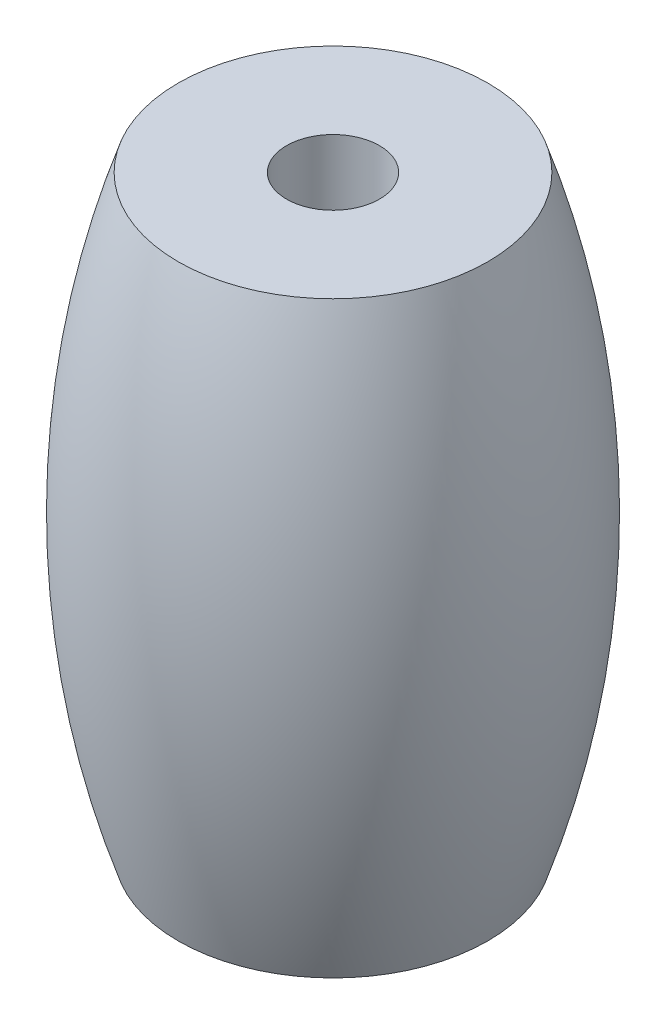
ISO-10303-21;
HEADER;
FILE_DESCRIPTION(('STEP AP214'),'2;1');
FILE_NAME('part.step','',(''),(''),'','','');
FILE_SCHEMA(('AUTOMOTIVE_DESIGN { 1 0 10303 214 1 1 1 1 }'));
ENDSEC;
DATA;
#1=APPLICATION_CONTEXT('core data for automotive mechanical design processes');
#2=APPLICATION_PROTOCOL_DEFINITION('international standard','automotive_design',2000,#1);
#3=PRODUCT_CONTEXT('',#1,'mechanical');
#4=PRODUCT('Part','Part','',(#3));
#5=PRODUCT_RELATED_PRODUCT_CATEGORY('part','',(#4));
#6=PRODUCT_DEFINITION_FORMATION('','',#4);
#7=PRODUCT_DEFINITION_CONTEXT('part definition',#1,'design');
#8=PRODUCT_DEFINITION('design','',#6,#7);
#9=PRODUCT_DEFINITION_SHAPE('','',#8);
#10=(LENGTH_UNIT() NAMED_UNIT(*) SI_UNIT(.MILLI.,.METRE.));
#11=(NAMED_UNIT(*) PLANE_ANGLE_UNIT() SI_UNIT($,.RADIAN.));
#12=(NAMED_UNIT(*) SI_UNIT($,.STERADIAN.) SOLID_ANGLE_UNIT());
#13=UNCERTAINTY_MEASURE_WITH_UNIT(LENGTH_MEASURE(1.E-05),#10,'distance_accuracy_value','');
#14=(GEOMETRIC_REPRESENTATION_CONTEXT(3) GLOBAL_UNCERTAINTY_ASSIGNED_CONTEXT((#13)) GLOBAL_UNIT_ASSIGNED_CONTEXT((#10,
#11,#12)) REPRESENTATION_CONTEXT('',''));
#15=CARTESIAN_POINT('',(0.,0.,0.));
#16=DIRECTION('',(0.,0.,1.));
#17=DIRECTION('',(1.,0.,0.));
#18=AXIS2_PLACEMENT_3D('',#15,#16,#17);
#19=CARTESIAN_POINT('',(-1.5,16.5643953211235,0.));
#20=DIRECTION('',(0.,-1.,0.));
#21=DIRECTION('',(0.,0.,-1.));
#22=AXIS2_PLACEMENT_3D('',#19,#20,#21);
#23=PLANE('',#22);
#24=CARTESIAN_POINT('',(0.,16.5643953211235,0.));
#25=DIRECTION('',(0.,-1.,0.));
#26=DIRECTION('',(0.,0.,-1.));
#27=AXIS2_PLACEMENT_3D('',#24,#25,#26);
#28=CIRCLE('',#27,5.);
#29=CARTESIAN_POINT('',(0.,16.5643953211235,-5.));
#30=VERTEX_POINT('',#29);
#31=EDGE_CURVE('E10',#30,#30,#28,.T.);
#32=ORIENTED_EDGE('',*,*,#31,.F.);
#33=EDGE_LOOP('',(#32));
#34=FACE_BOUND('',#33,.T.);
#35=CARTESIAN_POINT('',(0.,16.5643953211235,0.));
#36=DIRECTION('',(0.,-1.,0.));
#37=DIRECTION('',(0.,0.,-1.));
#38=AXIS2_PLACEMENT_3D('',#35,#36,#37);
#39=CIRCLE('',#38,1.5);
#40=CARTESIAN_POINT('',(0.,16.5643953211235,-1.5));
#41=VERTEX_POINT('',#40);
#42=EDGE_CURVE('E54',#41,#41,#39,.T.);
#43=ORIENTED_EDGE('',*,*,#42,.T.);
#44=EDGE_LOOP('',(#43));
#45=FACE_BOUND('',#44,.T.);
#46=ADVANCED_FACE('F37',(#34,#45),#23,.F.);
#47=CARTESIAN_POINT('',(0.,7.06439532112352,0.));
#48=DIRECTION('',(0.,-1.,0.));
#49=DIRECTION('',(0.,0.,-1.));
#50=AXIS2_PLACEMENT_3D('',#47,#48,#49);
#51=DEGENERATE_TOROIDAL_SURFACE('',#50,23.4561065502644,30.,.F.);
#52=CARTESIAN_POINT('',(0.,-2.43560467887649,0.));
#53=DIRECTION('',(0.,-1.,0.));
#54=DIRECTION('',(0.,0.,-1.));
#55=AXIS2_PLACEMENT_3D('',#52,#53,#54);
#56=CIRCLE('',#55,5.);
#57=CARTESIAN_POINT('',(0.,-2.43560467887649,-5.));
#58=VERTEX_POINT('',#57);
#59=EDGE_CURVE('E44',#58,#58,#56,.T.);
#60=ORIENTED_EDGE('',*,*,#59,.F.);
#61=EDGE_LOOP('',(#60));
#62=FACE_BOUND('',#61,.T.);
#63=ORIENTED_EDGE('',*,*,#31,.T.);
#64=EDGE_LOOP('',(#63));
#65=FACE_BOUND('',#64,.T.);
#66=ADVANCED_FACE('F70',(#62,#65),#51,.F.);
#67=CARTESIAN_POINT('',(-1.5,-2.43560467887649,0.));
#68=DIRECTION('',(0.,1.,0.));
#69=DIRECTION('',(0.,0.,1.));
#70=AXIS2_PLACEMENT_3D('',#67,#68,#69);
#71=PLANE('',#70);
#72=CARTESIAN_POINT('',(0.,-2.43560467887649,0.));
#73=DIRECTION('',(0.,-1.,0.));
#74=DIRECTION('',(0.,0.,-1.));
#75=AXIS2_PLACEMENT_3D('',#72,#73,#74);
#76=CIRCLE('',#75,1.5);
#77=CARTESIAN_POINT('',(0.,-2.43560467887649,-1.5));
#78=VERTEX_POINT('',#77);
#79=EDGE_CURVE('E49',#78,#78,#76,.T.);
#80=ORIENTED_EDGE('',*,*,#79,.F.);
#81=EDGE_LOOP('',(#80));
#82=FACE_BOUND('',#81,.T.);
#83=ORIENTED_EDGE('',*,*,#59,.T.);
#84=EDGE_LOOP('',(#83));
#85=FACE_BOUND('',#84,.T.);
#86=ADVANCED_FACE('F65',(#82,#85),#71,.F.);
#87=CARTESIAN_POINT('',(0.,0.,0.));
#88=DIRECTION('',(0.,-1.,0.));
#89=DIRECTION('',(0.,0.,-1.));
#90=AXIS2_PLACEMENT_3D('',#87,#88,#89);
#91=CYLINDRICAL_SURFACE('',#90,1.5);
#92=ORIENTED_EDGE('',*,*,#42,.F.);
#93=EDGE_LOOP('',(#92));
#94=FACE_BOUND('',#93,.T.);
#95=ORIENTED_EDGE('',*,*,#79,.T.);
#96=EDGE_LOOP('',(#95));
#97=FACE_BOUND('',#96,.T.);
#98=ADVANCED_FACE('F62',(#94,#97),#91,.F.);
#99=CLOSED_SHELL('',(#46,#66,#86,#98));
#100=MANIFOLD_SOLID_BREP('B2',#99);
#101=ADVANCED_BREP_SHAPE_REPRESENTATION('',(#18,#100),#14);
#102=SHAPE_DEFINITION_REPRESENTATION(#9,#101);
ENDSEC;
END-ISO-10303-21;
